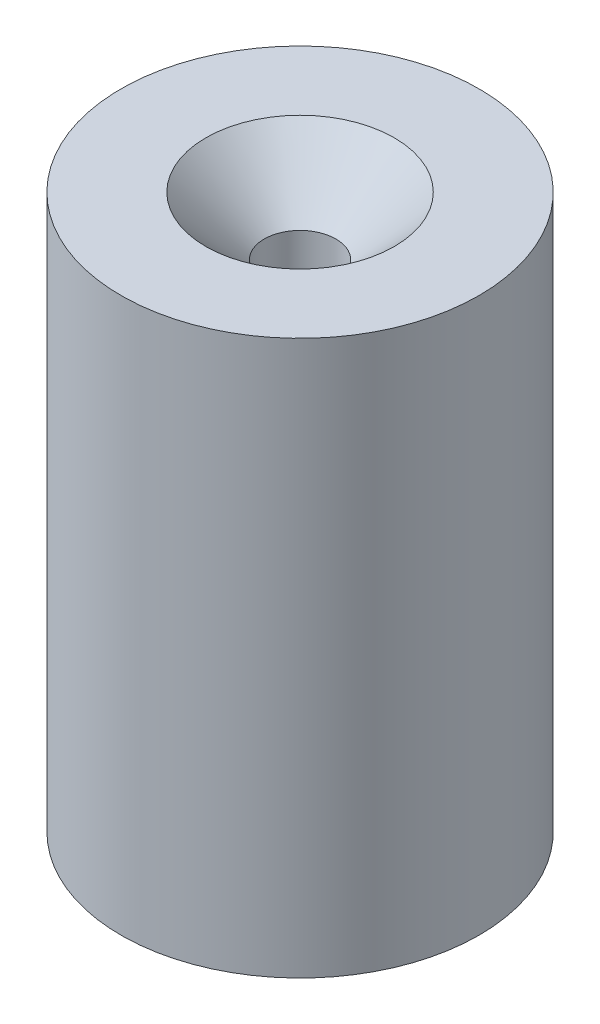
ISO-10303-21;
HEADER;
FILE_DESCRIPTION(('STEP AP214'),'2;1');
FILE_NAME('part.step','',(''),(''),'','','');
FILE_SCHEMA(('AUTOMOTIVE_DESIGN { 1 0 10303 214 1 1 1 1 }'));
ENDSEC;
DATA;
#1=APPLICATION_CONTEXT('core data for automotive mechanical design processes');
#2=APPLICATION_PROTOCOL_DEFINITION('international standard','automotive_design',2000,#1);
#3=PRODUCT_CONTEXT('',#1,'mechanical');
#4=PRODUCT('Part','Part','',(#3));
#5=PRODUCT_RELATED_PRODUCT_CATEGORY('part','',(#4));
#6=PRODUCT_DEFINITION_FORMATION('','',#4);
#7=PRODUCT_DEFINITION_CONTEXT('part definition',#1,'design');
#8=PRODUCT_DEFINITION('design','',#6,#7);
#9=PRODUCT_DEFINITION_SHAPE('','',#8);
#10=(LENGTH_UNIT() NAMED_UNIT(*) SI_UNIT(.MILLI.,.METRE.));
#11=(NAMED_UNIT(*) PLANE_ANGLE_UNIT() SI_UNIT($,.RADIAN.));
#12=(NAMED_UNIT(*) SI_UNIT($,.STERADIAN.) SOLID_ANGLE_UNIT());
#13=UNCERTAINTY_MEASURE_WITH_UNIT(LENGTH_MEASURE(1.E-05),#10,'distance_accuracy_value','');
#14=(GEOMETRIC_REPRESENTATION_CONTEXT(3) GLOBAL_UNCERTAINTY_ASSIGNED_CONTEXT((#13)) GLOBAL_UNIT_ASSIGNED_CONTEXT((#10,
#11,#12)) REPRESENTATION_CONTEXT('',''));
#15=CARTESIAN_POINT('',(0.,0.,0.));
#16=DIRECTION('',(0.,0.,1.));
#17=DIRECTION('',(1.,0.,0.));
#18=AXIS2_PLACEMENT_3D('',#15,#16,#17);
#19=CARTESIAN_POINT('',(0.,-0.775,0.));
#20=DIRECTION('',(0.,1.,0.));
#21=DIRECTION('',(1.,0.,0.));
#22=AXIS2_PLACEMENT_3D('',#19,#20,#21);
#23=CONICAL_SURFACE('',#22,1.725,0.7853981633973);
#24=CARTESIAN_POINT('',(0.,-1.55,0.));
#25=DIRECTION('',(0.,-1.,0.));
#26=DIRECTION('',(1.,0.,0.));
#27=AXIS2_PLACEMENT_3D('',#24,#25,#26);
#28=CIRCLE('',#27,0.95);
#29=CARTESIAN_POINT('',(0.95,-1.55,0.));
#30=VERTEX_POINT('',#29);
#31=EDGE_CURVE('E10',#30,#30,#28,.T.);
#32=ORIENTED_EDGE('',*,*,#31,.T.);
#33=EDGE_LOOP('',(#32));
#34=FACE_BOUND('',#33,.T.);
#35=CARTESIAN_POINT('',(0.,0.,0.));
#36=DIRECTION('',(0.,-1.,0.));
#37=DIRECTION('',(1.,0.,0.));
#38=AXIS2_PLACEMENT_3D('',#35,#36,#37);
#39=CIRCLE('',#38,2.5);
#40=CARTESIAN_POINT('',(2.5,0.,0.));
#41=VERTEX_POINT('',#40);
#42=EDGE_CURVE('E30',#41,#41,#39,.T.);
#43=ORIENTED_EDGE('',*,*,#42,.F.);
#44=EDGE_LOOP('',(#43));
#45=FACE_BOUND('',#44,.T.);
#46=ADVANCED_FACE('F15',(#34,#45),#23,.F.);
#47=CARTESIAN_POINT('',(0.,0.735,0.));
#48=DIRECTION('',(0.,-1.,0.));
#49=DIRECTION('',(-1.,0.,0.));
#50=AXIS2_PLACEMENT_3D('',#47,#48,#49);
#51=CYLINDRICAL_SURFACE('',#50,0.95);
#52=CARTESIAN_POINT('',(0.,-14.7,0.));
#53=DIRECTION('',(0.,1.,0.));
#54=DIRECTION('',(1.,0.,0.));
#55=AXIS2_PLACEMENT_3D('',#52,#53,#54);
#56=CIRCLE('',#55,0.95);
#57=CARTESIAN_POINT('',(0.95,-14.7,0.));
#58=VERTEX_POINT('',#57);
#59=EDGE_CURVE('E23',#58,#58,#56,.T.);
#60=ORIENTED_EDGE('',*,*,#59,.F.);
#61=EDGE_LOOP('',(#60));
#62=FACE_BOUND('',#61,.T.);
#63=ORIENTED_EDGE('',*,*,#31,.F.);
#64=EDGE_LOOP('',(#63));
#65=FACE_BOUND('',#64,.T.);
#66=ADVANCED_FACE('F46',(#62,#65),#51,.F.);
#67=CARTESIAN_POINT('',(0.,-14.7,0.));
#68=DIRECTION('',(0.,-1.,0.));
#69=DIRECTION('',(-1.,0.,0.));
#70=AXIS2_PLACEMENT_3D('',#67,#68,#69);
#71=PLANE('',#70);
#72=CARTESIAN_POINT('',(0.,-14.7,0.));
#73=DIRECTION('',(0.,1.,0.));
#74=DIRECTION('',(1.,0.,0.));
#75=AXIS2_PLACEMENT_3D('',#72,#73,#74);
#76=CIRCLE('',#75,4.75);
#77=CARTESIAN_POINT('',(4.75,-14.7,0.));
#78=VERTEX_POINT('',#77);
#79=EDGE_CURVE('E32',#78,#78,#76,.T.);
#80=ORIENTED_EDGE('',*,*,#79,.F.);
#81=EDGE_LOOP('',(#80));
#82=FACE_BOUND('',#81,.T.);
#83=ORIENTED_EDGE('',*,*,#59,.T.);
#84=EDGE_LOOP('',(#83));
#85=FACE_BOUND('',#84,.T.);
#86=ADVANCED_FACE('F52',(#82,#85),#71,.T.);
#87=CARTESIAN_POINT('',(0.,0.735,0.));
#88=DIRECTION('',(0.,-1.,0.));
#89=DIRECTION('',(-1.,0.,0.));
#90=AXIS2_PLACEMENT_3D('',#87,#88,#89);
#91=CYLINDRICAL_SURFACE('',#90,4.75);
#92=CARTESIAN_POINT('',(0.,0.,0.));
#93=DIRECTION('',(0.,-1.,0.));
#94=DIRECTION('',(1.,0.,0.));
#95=AXIS2_PLACEMENT_3D('',#92,#93,#94);
#96=CIRCLE('',#95,4.75);
#97=CARTESIAN_POINT('',(4.75,0.,0.));
#98=VERTEX_POINT('',#97);
#99=EDGE_CURVE('E19',#98,#98,#96,.T.);
#100=ORIENTED_EDGE('',*,*,#99,.T.);
#101=EDGE_LOOP('',(#100));
#102=FACE_BOUND('',#101,.T.);
#103=ORIENTED_EDGE('',*,*,#79,.T.);
#104=EDGE_LOOP('',(#103));
#105=FACE_BOUND('',#104,.T.);
#106=ADVANCED_FACE('F39',(#102,#105),#91,.T.);
#107=CARTESIAN_POINT('',(0.,0.,0.));
#108=DIRECTION('',(0.,-1.,0.));
#109=DIRECTION('',(-1.,0.,0.));
#110=AXIS2_PLACEMENT_3D('',#107,#108,#109);
#111=PLANE('',#110);
#112=ORIENTED_EDGE('',*,*,#99,.F.);
#113=EDGE_LOOP('',(#112));
#114=FACE_BOUND('',#113,.T.);
#115=ORIENTED_EDGE('',*,*,#42,.T.);
#116=EDGE_LOOP('',(#115));
#117=FACE_BOUND('',#116,.T.);
#118=ADVANCED_FACE('F17',(#114,#117),#111,.F.);
#119=CLOSED_SHELL('',(#46,#66,#86,#106,#118));
#120=MANIFOLD_SOLID_BREP('B1',#119);
#121=ADVANCED_BREP_SHAPE_REPRESENTATION('',(#18,#120),#14);
#122=SHAPE_DEFINITION_REPRESENTATION(#9,#121);
ENDSEC;
END-ISO-10303-21;
